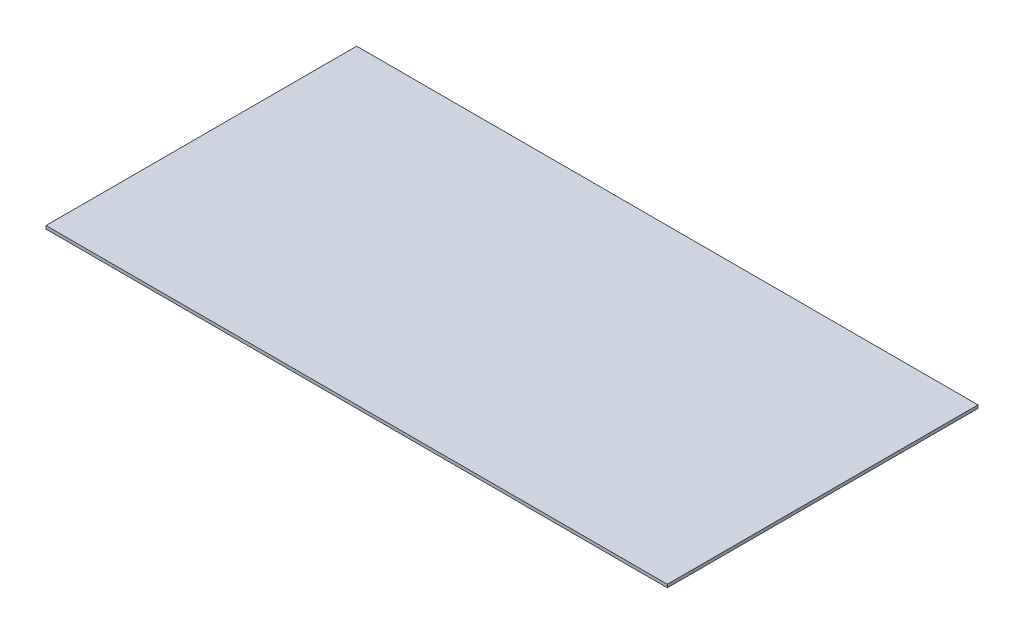
ISO-10303-21;
HEADER;
FILE_DESCRIPTION(('STEP AP214'),'2;1');
FILE_NAME('part.step','',(''),(''),'','','');
FILE_SCHEMA(('AUTOMOTIVE_DESIGN { 1 0 10303 214 1 1 1 1 }'));
ENDSEC;
DATA;
#1=APPLICATION_CONTEXT('core data for automotive mechanical design processes');
#2=APPLICATION_PROTOCOL_DEFINITION('international standard','automotive_design',2000,#1);
#3=PRODUCT_CONTEXT('',#1,'mechanical');
#4=PRODUCT('Part','Part','',(#3));
#5=PRODUCT_RELATED_PRODUCT_CATEGORY('part','',(#4));
#6=PRODUCT_DEFINITION_FORMATION('','',#4);
#7=PRODUCT_DEFINITION_CONTEXT('part definition',#1,'design');
#8=PRODUCT_DEFINITION('design','',#6,#7);
#9=PRODUCT_DEFINITION_SHAPE('','',#8);
#10=(LENGTH_UNIT() NAMED_UNIT(*) SI_UNIT(.MILLI.,.METRE.));
#11=(NAMED_UNIT(*) PLANE_ANGLE_UNIT() SI_UNIT($,.RADIAN.));
#12=(NAMED_UNIT(*) SI_UNIT($,.STERADIAN.) SOLID_ANGLE_UNIT());
#13=UNCERTAINTY_MEASURE_WITH_UNIT(LENGTH_MEASURE(1.E-05),#10,'distance_accuracy_value','');
#14=(GEOMETRIC_REPRESENTATION_CONTEXT(3) GLOBAL_UNCERTAINTY_ASSIGNED_CONTEXT((#13)) GLOBAL_UNIT_ASSIGNED_CONTEXT((#10,
#11,#12)) REPRESENTATION_CONTEXT('',''));
#15=CARTESIAN_POINT('',(0.,0.,0.));
#16=DIRECTION('',(0.,0.,1.));
#17=DIRECTION('',(1.,0.,0.));
#18=AXIS2_PLACEMENT_3D('',#15,#16,#17);
#19=CARTESIAN_POINT('',(-10000.,100.,-5000.));
#20=DIRECTION('',(1.,0.,0.));
#21=DIRECTION('',(0.,0.,-1.));
#22=AXIS2_PLACEMENT_3D('',#19,#20,#21);
#23=PLANE('',#22);
#24=DIRECTION('',(0.,0.,1.));
#25=VECTOR('',#24,1.);
#26=CARTESIAN_POINT('',(-10000.,0.,-5000.));
#27=LINE('',#26,#25);
#28=CARTESIAN_POINT('',(-10000.,0.,-5000.));
#29=VERTEX_POINT('',#28);
#30=CARTESIAN_POINT('',(-10000.,0.,5000.));
#31=VERTEX_POINT('',#30);
#32=EDGE_CURVE('E107',#29,#31,#27,.T.);
#33=ORIENTED_EDGE('',*,*,#32,.T.);
#34=DIRECTION('',(0.,-1.,0.));
#35=VECTOR('',#34,1.);
#36=CARTESIAN_POINT('',(-10000.,100.,5000.));
#37=LINE('',#36,#35);
#38=CARTESIAN_POINT('',(-10000.,100.,5000.));
#39=VERTEX_POINT('',#38);
#40=EDGE_CURVE('E11',#39,#31,#37,.T.);
#41=ORIENTED_EDGE('',*,*,#40,.F.);
#42=DIRECTION('',(0.,0.,1.));
#43=VECTOR('',#42,1.);
#44=CARTESIAN_POINT('',(-10000.,100.,-5000.));
#45=LINE('',#44,#43);
#46=CARTESIAN_POINT('',(-10000.,100.,-5000.));
#47=VERTEX_POINT('',#46);
#48=EDGE_CURVE('E91',#47,#39,#45,.T.);
#49=ORIENTED_EDGE('',*,*,#48,.F.);
#50=DIRECTION('',(0.,-1.,0.));
#51=VECTOR('',#50,1.);
#52=CARTESIAN_POINT('',(-10000.,100.,-5000.));
#53=LINE('',#52,#51);
#54=EDGE_CURVE('E103',#47,#29,#53,.T.);
#55=ORIENTED_EDGE('',*,*,#54,.T.);
#56=EDGE_LOOP('',(#33,#41,#49,#55));
#57=FACE_BOUND('',#56,.T.);
#58=ADVANCED_FACE('F39',(#57),#23,.F.);
#59=CARTESIAN_POINT('',(-10000.,100.,5000.));
#60=DIRECTION('',(0.,0.,-1.));
#61=DIRECTION('',(-1.,0.,0.));
#62=AXIS2_PLACEMENT_3D('',#59,#60,#61);
#63=PLANE('',#62);
#64=DIRECTION('',(1.,0.,0.));
#65=VECTOR('',#64,1.);
#66=CARTESIAN_POINT('',(-10000.,0.,5000.));
#67=LINE('',#66,#65);
#68=CARTESIAN_POINT('',(10000.,0.,5000.));
#69=VERTEX_POINT('',#68);
#70=EDGE_CURVE('E96',#31,#69,#67,.T.);
#71=ORIENTED_EDGE('',*,*,#70,.T.);
#72=DIRECTION('',(0.,-1.,0.));
#73=VECTOR('',#72,1.);
#74=CARTESIAN_POINT('',(10000.,100.,5000.));
#75=LINE('',#74,#73);
#76=CARTESIAN_POINT('',(10000.,100.,5000.));
#77=VERTEX_POINT('',#76);
#78=EDGE_CURVE('E48',#77,#69,#75,.T.);
#79=ORIENTED_EDGE('',*,*,#78,.F.);
#80=DIRECTION('',(1.,0.,0.));
#81=VECTOR('',#80,1.);
#82=CARTESIAN_POINT('',(-10000.,100.,5000.));
#83=LINE('',#82,#81);
#84=EDGE_CURVE('E86',#39,#77,#83,.T.);
#85=ORIENTED_EDGE('',*,*,#84,.F.);
#86=ORIENTED_EDGE('',*,*,#40,.T.);
#87=EDGE_LOOP('',(#71,#79,#85,#86));
#88=FACE_BOUND('',#87,.T.);
#89=ADVANCED_FACE('F95',(#88),#63,.F.);
#90=CARTESIAN_POINT('',(10000.,100.,-5000.));
#91=DIRECTION('',(-1.,0.,0.));
#92=DIRECTION('',(0.,0.,1.));
#93=AXIS2_PLACEMENT_3D('',#90,#91,#92);
#94=PLANE('',#93);
#95=DIRECTION('',(0.,0.,-1.));
#96=VECTOR('',#95,1.);
#97=CARTESIAN_POINT('',(10000.,0.,-5000.));
#98=LINE('',#97,#96);
#99=CARTESIAN_POINT('',(10000.,0.,-5000.));
#100=VERTEX_POINT('',#99);
#101=EDGE_CURVE('E73',#69,#100,#98,.T.);
#102=ORIENTED_EDGE('',*,*,#101,.T.);
#103=DIRECTION('',(0.,-1.,0.));
#104=VECTOR('',#103,1.);
#105=CARTESIAN_POINT('',(10000.,100.,-5000.));
#106=LINE('',#105,#104);
#107=CARTESIAN_POINT('',(10000.,100.,-5000.));
#108=VERTEX_POINT('',#107);
#109=EDGE_CURVE('E98',#108,#100,#106,.T.);
#110=ORIENTED_EDGE('',*,*,#109,.F.);
#111=DIRECTION('',(0.,0.,-1.));
#112=VECTOR('',#111,1.);
#113=CARTESIAN_POINT('',(10000.,100.,-5000.));
#114=LINE('',#113,#112);
#115=EDGE_CURVE('E89',#77,#108,#114,.T.);
#116=ORIENTED_EDGE('',*,*,#115,.F.);
#117=ORIENTED_EDGE('',*,*,#78,.T.);
#118=EDGE_LOOP('',(#102,#110,#116,#117));
#119=FACE_BOUND('',#118,.T.);
#120=ADVANCED_FACE('F99',(#119),#94,.F.);
#121=CARTESIAN_POINT('',(-10000.,100.,-5000.));
#122=DIRECTION('',(0.,0.,1.));
#123=DIRECTION('',(1.,0.,0.));
#124=AXIS2_PLACEMENT_3D('',#121,#122,#123);
#125=PLANE('',#124);
#126=DIRECTION('',(-1.,0.,0.));
#127=VECTOR('',#126,1.);
#128=CARTESIAN_POINT('',(-10000.,0.,-5000.));
#129=LINE('',#128,#127);
#130=EDGE_CURVE('E79',#100,#29,#129,.T.);
#131=ORIENTED_EDGE('',*,*,#130,.T.);
#132=ORIENTED_EDGE('',*,*,#54,.F.);
#133=DIRECTION('',(-1.,0.,0.));
#134=VECTOR('',#133,1.);
#135=CARTESIAN_POINT('',(-10000.,100.,-5000.));
#136=LINE('',#135,#134);
#137=EDGE_CURVE('E56',#108,#47,#136,.T.);
#138=ORIENTED_EDGE('',*,*,#137,.F.);
#139=ORIENTED_EDGE('',*,*,#109,.T.);
#140=EDGE_LOOP('',(#131,#132,#138,#139));
#141=FACE_BOUND('',#140,.T.);
#142=ADVANCED_FACE('F120',(#141),#125,.F.);
#143=CARTESIAN_POINT('',(0.,100.,0.));
#144=DIRECTION('',(0.,1.,0.));
#145=DIRECTION('',(0.,0.,1.));
#146=AXIS2_PLACEMENT_3D('',#143,#144,#145);
#147=PLANE('',#146);
#148=ORIENTED_EDGE('',*,*,#48,.T.);
#149=ORIENTED_EDGE('',*,*,#84,.T.);
#150=ORIENTED_EDGE('',*,*,#115,.T.);
#151=ORIENTED_EDGE('',*,*,#137,.T.);
#152=EDGE_LOOP('',(#148,#149,#150,#151));
#153=FACE_BOUND('',#152,.T.);
#154=ADVANCED_FACE('F87',(#153),#147,.T.);
#155=CARTESIAN_POINT('',(0.,0.,0.));
#156=DIRECTION('',(0.,1.,0.));
#157=DIRECTION('',(0.,0.,1.));
#158=AXIS2_PLACEMENT_3D('',#155,#156,#157);
#159=PLANE('',#158);
#160=ORIENTED_EDGE('',*,*,#32,.F.);
#161=ORIENTED_EDGE('',*,*,#130,.F.);
#162=ORIENTED_EDGE('',*,*,#101,.F.);
#163=ORIENTED_EDGE('',*,*,#70,.F.);
#164=EDGE_LOOP('',(#160,#161,#162,#163));
#165=FACE_BOUND('',#164,.T.);
#166=ADVANCED_FACE('F123',(#165),#159,.F.);
#167=CLOSED_SHELL('',(#58,#89,#120,#142,#154,#166));
#168=MANIFOLD_SOLID_BREP('B2',#167);
#169=ADVANCED_BREP_SHAPE_REPRESENTATION('',(#18,#168),#14);
#170=SHAPE_DEFINITION_REPRESENTATION(#9,#169);
ENDSEC;
END-ISO-10303-21;
